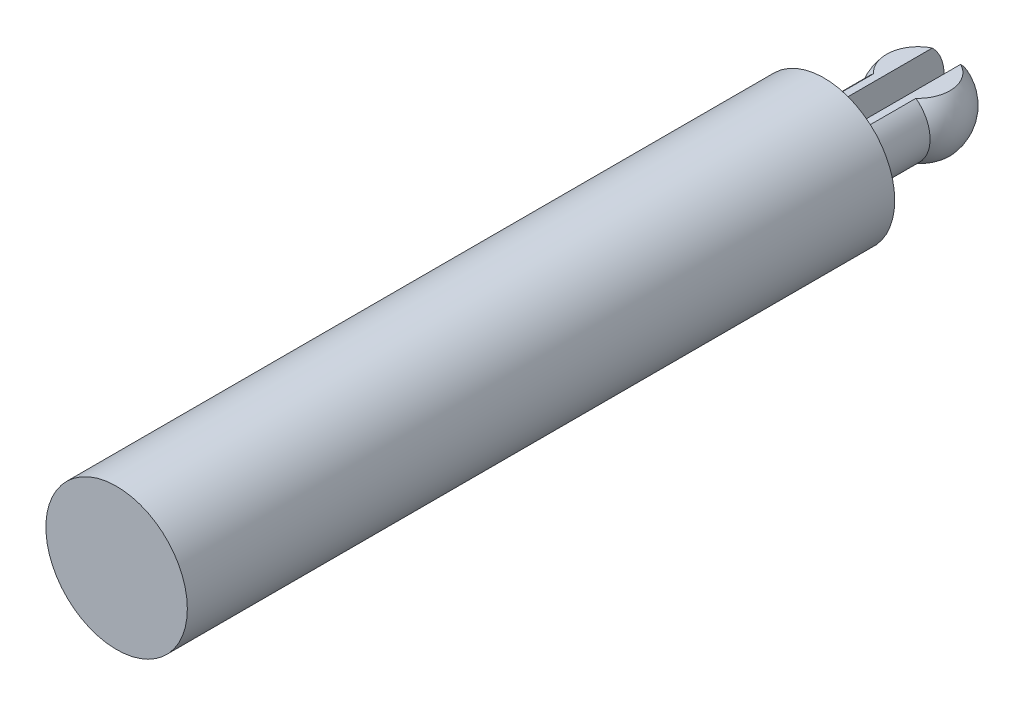
ISO-10303-21;
HEADER;
FILE_DESCRIPTION(('STEP AP214'),'2;1');
FILE_NAME('part.step','',(''),(''),'','','');
FILE_SCHEMA(('AUTOMOTIVE_DESIGN { 1 0 10303 214 1 1 1 1 }'));
ENDSEC;
DATA;
#1=APPLICATION_CONTEXT('core data for automotive mechanical design processes');
#2=APPLICATION_PROTOCOL_DEFINITION('international standard','automotive_design',2000,#1);
#3=PRODUCT_CONTEXT('',#1,'mechanical');
#4=PRODUCT('Part','Part','',(#3));
#5=PRODUCT_RELATED_PRODUCT_CATEGORY('part','',(#4));
#6=PRODUCT_DEFINITION_FORMATION('','',#4);
#7=PRODUCT_DEFINITION_CONTEXT('part definition',#1,'design');
#8=PRODUCT_DEFINITION('design','',#6,#7);
#9=PRODUCT_DEFINITION_SHAPE('','',#8);
#10=(LENGTH_UNIT() NAMED_UNIT(*) SI_UNIT(.MILLI.,.METRE.));
#11=(NAMED_UNIT(*) PLANE_ANGLE_UNIT() SI_UNIT($,.RADIAN.));
#12=(NAMED_UNIT(*) SI_UNIT($,.STERADIAN.) SOLID_ANGLE_UNIT());
#13=UNCERTAINTY_MEASURE_WITH_UNIT(LENGTH_MEASURE(1.E-05),#10,'distance_accuracy_value','');
#14=(GEOMETRIC_REPRESENTATION_CONTEXT(3) GLOBAL_UNCERTAINTY_ASSIGNED_CONTEXT((#13)) GLOBAL_UNIT_ASSIGNED_CONTEXT((#10,
#11,#12)) REPRESENTATION_CONTEXT('',''));
#15=CARTESIAN_POINT('',(0.,0.,0.));
#16=DIRECTION('',(0.,0.,1.));
#17=DIRECTION('',(1.,0.,0.));
#18=AXIS2_PLACEMENT_3D('',#15,#16,#17);
#19=CARTESIAN_POINT('',(0.,0.,-5.));
#20=DIRECTION('',(0.,0.,1.));
#21=DIRECTION('',(1.,0.,0.));
#22=AXIS2_PLACEMENT_3D('',#19,#20,#21);
#23=CYLINDRICAL_SURFACE('',#22,2.5);
#24=DIRECTION('',(0.,0.,1.));
#25=VECTOR('',#24,1.);
#26=CARTESIAN_POINT('',(-1.5,2.,-5.));
#27=LINE('',#26,#25);
#28=CARTESIAN_POINT('',(-1.5,2.,-5.));
#29=VERTEX_POINT('',#28);
#30=CARTESIAN_POINT('',(-1.5,2.,0.));
#31=VERTEX_POINT('',#30);
#32=EDGE_CURVE('E152',#29,#31,#27,.T.);
#33=ORIENTED_EDGE('',*,*,#32,.F.);
#34=CARTESIAN_POINT('',(0.,0.,-5.));
#35=DIRECTION('',(0.,0.,-1.));
#36=DIRECTION('',(-1.,0.,0.));
#37=AXIS2_PLACEMENT_3D('',#34,#35,#36);
#38=CIRCLE('',#37,2.5);
#39=CARTESIAN_POINT('',(-1.5,-2.,-5.));
#40=VERTEX_POINT('',#39);
#41=EDGE_CURVE('E119',#40,#29,#38,.T.);
#42=ORIENTED_EDGE('',*,*,#41,.F.);
#43=DIRECTION('',(0.,0.,1.));
#44=VECTOR('',#43,1.);
#45=CARTESIAN_POINT('',(-1.5,-2.,-5.));
#46=LINE('',#45,#44);
#47=CARTESIAN_POINT('',(-1.5,-2.,0.));
#48=VERTEX_POINT('',#47);
#49=EDGE_CURVE('E106',#48,#40,#46,.F.);
#50=ORIENTED_EDGE('',*,*,#49,.F.);
#51=CARTESIAN_POINT('',(0.,0.,0.));
#52=DIRECTION('',(0.,0.,-1.));
#53=DIRECTION('',(-1.,0.,0.));
#54=AXIS2_PLACEMENT_3D('',#51,#52,#53);
#55=CIRCLE('',#54,2.5);
#56=EDGE_CURVE('E117',#48,#31,#55,.T.);
#57=ORIENTED_EDGE('',*,*,#56,.T.);
#58=EDGE_LOOP('',(#33,#42,#50,#57));
#59=FACE_BOUND('',#58,.T.);
#60=ADVANCED_FACE('F39',(#59),#23,.T.);
#61=CARTESIAN_POINT('',(0.,0.,-6.6583123951777));
#62=DIRECTION('',(0.,1.,0.));
#63=DIRECTION('',(0.,0.,-1.));
#64=AXIS2_PLACEMENT_3D('',#61,#62,#63);
#65=SPHERICAL_SURFACE('',#64,3.);
#66=ORIENTED_EDGE('',*,*,#41,.T.);
#67=CARTESIAN_POINT('',(0.,2.,-6.6583123951777));
#68=DIRECTION('',(0.,1.,0.));
#69=DIRECTION('',(0.,0.,1.));
#70=AXIS2_PLACEMENT_3D('',#67,#68,#69);
#71=CIRCLE('',#70,2.23606797749979);
#72=CARTESIAN_POINT('',(-1.,2.,-8.6583123951777));
#73=VERTEX_POINT('',#72);
#74=EDGE_CURVE('E150',#29,#73,#71,.F.);
#75=ORIENTED_EDGE('',*,*,#74,.T.);
#76=CARTESIAN_POINT('',(-1.,0.,-6.6583123951777));
#77=DIRECTION('',(1.,0.,0.));
#78=DIRECTION('',(0.,0.,-1.));
#79=AXIS2_PLACEMENT_3D('',#76,#77,#78);
#80=CIRCLE('',#79,2.82842712474619);
#81=CARTESIAN_POINT('',(-1.,-2.,-8.6583123951777));
#82=VERTEX_POINT('',#81);
#83=EDGE_CURVE('E129',#73,#82,#80,.F.);
#84=ORIENTED_EDGE('',*,*,#83,.T.);
#85=CARTESIAN_POINT('',(0.,-2.,-6.6583123951777));
#86=DIRECTION('',(0.,-1.,0.));
#87=DIRECTION('',(0.,0.,-1.));
#88=AXIS2_PLACEMENT_3D('',#85,#86,#87);
#89=CIRCLE('',#88,2.23606797749979);
#90=EDGE_CURVE('E121',#82,#40,#89,.F.);
#91=ORIENTED_EDGE('',*,*,#90,.T.);
#92=EDGE_LOOP('',(#66,#75,#84,#91));
#93=FACE_BOUND('',#92,.T.);
#94=ADVANCED_FACE('F149',(#93),#65,.T.);
#95=DIRECTION('',(0.,0.,1.));
#96=VECTOR('',#95,1.);
#97=CARTESIAN_POINT('',(1.5,2.,-5.));
#98=LINE('',#97,#96);
#99=CARTESIAN_POINT('',(1.5,2.,0.));
#100=VERTEX_POINT('',#99);
#101=CARTESIAN_POINT('',(1.5,2.,-5.));
#102=VERTEX_POINT('',#101);
#103=EDGE_CURVE('E165',#100,#102,#98,.F.);
#104=ORIENTED_EDGE('',*,*,#103,.F.);
#105=CARTESIAN_POINT('',(1.5,-2.,0.));
#106=VERTEX_POINT('',#105);
#107=EDGE_CURVE('E125',#100,#106,#55,.T.);
#108=ORIENTED_EDGE('',*,*,#107,.T.);
#109=DIRECTION('',(0.,0.,1.));
#110=VECTOR('',#109,1.);
#111=CARTESIAN_POINT('',(1.5,-2.,-5.));
#112=LINE('',#111,#110);
#113=CARTESIAN_POINT('',(1.5,-2.,-5.));
#114=VERTEX_POINT('',#113);
#115=EDGE_CURVE('E153',#114,#106,#112,.T.);
#116=ORIENTED_EDGE('',*,*,#115,.F.);
#117=EDGE_CURVE('E138',#102,#114,#38,.T.);
#118=ORIENTED_EDGE('',*,*,#117,.F.);
#119=EDGE_LOOP('',(#104,#108,#116,#118));
#120=FACE_BOUND('',#119,.T.);
#121=ADVANCED_FACE('F178',(#120),#23,.T.);
#122=CARTESIAN_POINT('',(1.,0.,-6.6583123951777));
#123=DIRECTION('',(1.,0.,0.));
#124=DIRECTION('',(0.,0.,-1.));
#125=AXIS2_PLACEMENT_3D('',#122,#123,#124);
#126=CIRCLE('',#125,2.82842712474619);
#127=CARTESIAN_POINT('',(1.,2.,-8.6583123951777));
#128=VERTEX_POINT('',#127);
#129=CARTESIAN_POINT('',(1.,-2.,-8.6583123951777));
#130=VERTEX_POINT('',#129);
#131=EDGE_CURVE('E141',#128,#130,#126,.F.);
#132=ORIENTED_EDGE('',*,*,#131,.F.);
#133=CARTESIAN_POINT('',(0.,2.,-6.6583123951777));
#134=DIRECTION('',(0.,1.,0.));
#135=DIRECTION('',(0.,0.,1.));
#136=AXIS2_PLACEMENT_3D('',#133,#134,#135);
#137=CIRCLE('',#136,2.23606797749979);
#138=EDGE_CURVE('E162',#128,#102,#137,.F.);
#139=ORIENTED_EDGE('',*,*,#138,.T.);
#140=ORIENTED_EDGE('',*,*,#117,.T.);
#141=CARTESIAN_POINT('',(0.,-2.,-6.6583123951777));
#142=DIRECTION('',(0.,-1.,0.));
#143=DIRECTION('',(0.,0.,-1.));
#144=AXIS2_PLACEMENT_3D('',#141,#142,#143);
#145=CIRCLE('',#144,2.23606797749979);
#146=EDGE_CURVE('E157',#114,#130,#145,.F.);
#147=ORIENTED_EDGE('',*,*,#146,.T.);
#148=EDGE_LOOP('',(#132,#139,#140,#147));
#149=FACE_BOUND('',#148,.T.);
#150=ADVANCED_FACE('F174',(#149),#65,.T.);
#151=CARTESIAN_POINT('',(1.,-5.28933092224249,-9.6583123951777));
#152=DIRECTION('',(1.,0.,0.));
#153=DIRECTION('',(0.,0.,-1.));
#154=AXIS2_PLACEMENT_3D('',#151,#152,#153);
#155=PLANE('',#154);
#156=DIRECTION('',(0.,0.,1.));
#157=VECTOR('',#156,1.);
#158=CARTESIAN_POINT('',(1.,2.,-9.6583123951777));
#159=LINE('',#158,#157);
#160=CARTESIAN_POINT('',(1.,2.,0.));
#161=VERTEX_POINT('',#160);
#162=EDGE_CURVE('E155',#128,#161,#159,.T.);
#163=ORIENTED_EDGE('',*,*,#162,.F.);
#164=ORIENTED_EDGE('',*,*,#131,.T.);
#165=DIRECTION('',(0.,0.,-1.));
#166=VECTOR('',#165,1.);
#167=CARTESIAN_POINT('',(1.,-2.,-9.6583123951777));
#168=LINE('',#167,#166);
#169=CARTESIAN_POINT('',(1.,-2.,0.));
#170=VERTEX_POINT('',#169);
#171=EDGE_CURVE('E120',#170,#130,#168,.T.);
#172=ORIENTED_EDGE('',*,*,#171,.F.);
#173=DIRECTION('',(0.,1.,0.));
#174=VECTOR('',#173,1.);
#175=CARTESIAN_POINT('',(1.,-5.28933092224249,0.));
#176=LINE('',#175,#174);
#177=EDGE_CURVE('E167',#170,#161,#176,.T.);
#178=ORIENTED_EDGE('',*,*,#177,.T.);
#179=EDGE_LOOP('',(#163,#164,#172,#178));
#180=FACE_BOUND('',#179,.T.);
#181=ADVANCED_FACE('F189',(#180),#155,.F.);
#182=CARTESIAN_POINT('',(-1.,-5.28933092224249,-9.6583123951777));
#183=DIRECTION('',(1.,0.,0.));
#184=DIRECTION('',(0.,0.,-1.));
#185=AXIS2_PLACEMENT_3D('',#182,#183,#184);
#186=PLANE('',#185);
#187=ORIENTED_EDGE('',*,*,#83,.F.);
#188=DIRECTION('',(0.,0.,1.));
#189=VECTOR('',#188,1.);
#190=CARTESIAN_POINT('',(-1.,2.,-9.6583123951777));
#191=LINE('',#190,#189);
#192=CARTESIAN_POINT('',(-1.,2.,0.));
#193=VERTEX_POINT('',#192);
#194=EDGE_CURVE('E11',#73,#193,#191,.T.);
#195=ORIENTED_EDGE('',*,*,#194,.T.);
#196=DIRECTION('',(0.,1.,0.));
#197=VECTOR('',#196,1.);
#198=CARTESIAN_POINT('',(-1.,-5.28933092224249,0.));
#199=LINE('',#198,#197);
#200=CARTESIAN_POINT('',(-1.,-2.,0.));
#201=VERTEX_POINT('',#200);
#202=EDGE_CURVE('E146',#201,#193,#199,.T.);
#203=ORIENTED_EDGE('',*,*,#202,.F.);
#204=DIRECTION('',(0.,0.,-1.));
#205=VECTOR('',#204,1.);
#206=CARTESIAN_POINT('',(-1.,-2.,-9.6583123951777));
#207=LINE('',#206,#205);
#208=EDGE_CURVE('E47',#201,#82,#207,.T.);
#209=ORIENTED_EDGE('',*,*,#208,.T.);
#210=EDGE_LOOP('',(#187,#195,#203,#209));
#211=FACE_BOUND('',#210,.T.);
#212=ADVANCED_FACE('F145',(#211),#186,.T.);
#213=CARTESIAN_POINT('',(0.,0.,50.));
#214=DIRECTION('',(0.,0.,-1.));
#215=DIRECTION('',(-1.,0.,0.));
#216=AXIS2_PLACEMENT_3D('',#213,#214,#215);
#217=CYLINDRICAL_SURFACE('',#216,5.00000000000005);
#218=CARTESIAN_POINT('',(0.,0.,50.));
#219=DIRECTION('',(0.,0.,1.));
#220=DIRECTION('',(1.,0.,0.));
#221=AXIS2_PLACEMENT_3D('',#218,#219,#220);
#222=CIRCLE('',#221,5.00000000000005);
#223=CARTESIAN_POINT('',(5.00000000000005,0.,50.));
#224=VERTEX_POINT('',#223);
#225=EDGE_CURVE('E126',#224,#224,#222,.T.);
#226=ORIENTED_EDGE('',*,*,#225,.F.);
#227=EDGE_LOOP('',(#226));
#228=FACE_BOUND('',#227,.T.);
#229=CARTESIAN_POINT('',(0.,0.,0.));
#230=DIRECTION('',(0.,0.,1.));
#231=DIRECTION('',(1.,0.,0.));
#232=AXIS2_PLACEMENT_3D('',#229,#230,#231);
#233=CIRCLE('',#232,5.00000000000005);
#234=CARTESIAN_POINT('',(5.00000000000005,0.,0.));
#235=VERTEX_POINT('',#234);
#236=EDGE_CURVE('E131',#235,#235,#233,.T.);
#237=ORIENTED_EDGE('',*,*,#236,.T.);
#238=EDGE_LOOP('',(#237));
#239=FACE_BOUND('',#238,.T.);
#240=ADVANCED_FACE('F41',(#228,#239),#217,.T.);
#241=CARTESIAN_POINT('',(0.,0.,50.));
#242=DIRECTION('',(0.,0.,1.));
#243=DIRECTION('',(1.,0.,0.));
#244=AXIS2_PLACEMENT_3D('',#241,#242,#243);
#245=PLANE('',#244);
#246=ORIENTED_EDGE('',*,*,#225,.T.);
#247=EDGE_LOOP('',(#246));
#248=FACE_BOUND('',#247,.T.);
#249=ADVANCED_FACE('F221',(#248),#245,.T.);
#250=CARTESIAN_POINT('',(0.,0.,0.));
#251=DIRECTION('',(0.,0.,1.));
#252=DIRECTION('',(1.,0.,0.));
#253=AXIS2_PLACEMENT_3D('',#250,#251,#252);
#254=PLANE('',#253);
#255=DIRECTION('',(-1.,0.,0.));
#256=VECTOR('',#255,1.);
#257=CARTESIAN_POINT('',(5.00000000000005,2.,0.));
#258=LINE('',#257,#256);
#259=EDGE_CURVE('E110',#193,#31,#258,.T.);
#260=ORIENTED_EDGE('',*,*,#259,.T.);
#261=ORIENTED_EDGE('',*,*,#56,.F.);
#262=DIRECTION('',(1.,0.,0.));
#263=VECTOR('',#262,1.);
#264=CARTESIAN_POINT('',(5.00000000000005,-2.,0.));
#265=LINE('',#264,#263);
#266=EDGE_CURVE('E62',#48,#201,#265,.T.);
#267=ORIENTED_EDGE('',*,*,#266,.T.);
#268=ORIENTED_EDGE('',*,*,#202,.T.);
#269=EDGE_LOOP('',(#260,#261,#267,#268));
#270=FACE_BOUND('',#269,.T.);
#271=ORIENTED_EDGE('',*,*,#107,.F.);
#272=EDGE_CURVE('E54',#100,#161,#258,.T.);
#273=ORIENTED_EDGE('',*,*,#272,.T.);
#274=ORIENTED_EDGE('',*,*,#177,.F.);
#275=EDGE_CURVE('E111',#170,#106,#265,.T.);
#276=ORIENTED_EDGE('',*,*,#275,.T.);
#277=EDGE_LOOP('',(#271,#273,#274,#276));
#278=FACE_BOUND('',#277,.T.);
#279=ORIENTED_EDGE('',*,*,#236,.F.);
#280=EDGE_LOOP('',(#279));
#281=FACE_BOUND('',#280,.T.);
#282=ADVANCED_FACE('F124',(#270,#278,#281),#254,.F.);
#283=CARTESIAN_POINT('',(5.00000000000005,-2.,-9.48673951992389));
#284=DIRECTION('',(0.,-1.,0.));
#285=DIRECTION('',(0.,0.,-1.));
#286=AXIS2_PLACEMENT_3D('',#283,#284,#285);
#287=PLANE('',#286);
#288=ORIENTED_EDGE('',*,*,#49,.T.);
#289=ORIENTED_EDGE('',*,*,#90,.F.);
#290=ORIENTED_EDGE('',*,*,#208,.F.);
#291=ORIENTED_EDGE('',*,*,#266,.F.);
#292=EDGE_LOOP('',(#288,#289,#290,#291));
#293=FACE_BOUND('',#292,.T.);
#294=ADVANCED_FACE('F105',(#293),#287,.T.);
#295=CARTESIAN_POINT('',(5.00000000000005,2.,-9.48673951992389));
#296=DIRECTION('',(0.,1.,0.));
#297=DIRECTION('',(0.,0.,1.));
#298=AXIS2_PLACEMENT_3D('',#295,#296,#297);
#299=PLANE('',#298);
#300=ORIENTED_EDGE('',*,*,#32,.T.);
#301=ORIENTED_EDGE('',*,*,#259,.F.);
#302=ORIENTED_EDGE('',*,*,#194,.F.);
#303=ORIENTED_EDGE('',*,*,#74,.F.);
#304=EDGE_LOOP('',(#300,#301,#302,#303));
#305=FACE_BOUND('',#304,.T.);
#306=ADVANCED_FACE('F194',(#305),#299,.T.);
#307=ORIENTED_EDGE('',*,*,#115,.T.);
#308=ORIENTED_EDGE('',*,*,#275,.F.);
#309=ORIENTED_EDGE('',*,*,#171,.T.);
#310=ORIENTED_EDGE('',*,*,#146,.F.);
#311=EDGE_LOOP('',(#307,#308,#309,#310));
#312=FACE_BOUND('',#311,.T.);
#313=ADVANCED_FACE('F181',(#312),#287,.T.);
#314=ORIENTED_EDGE('',*,*,#103,.T.);
#315=ORIENTED_EDGE('',*,*,#138,.F.);
#316=ORIENTED_EDGE('',*,*,#162,.T.);
#317=ORIENTED_EDGE('',*,*,#272,.F.);
#318=EDGE_LOOP('',(#314,#315,#316,#317));
#319=FACE_BOUND('',#318,.T.);
#320=ADVANCED_FACE('F191',(#319),#299,.T.);
#321=CLOSED_SHELL('',(#60,#94,#121,#150,#181,#212,#240,#249,#282,#294,#306,#313,#320));
#322=MANIFOLD_SOLID_BREP('B2',#321);
#323=ADVANCED_BREP_SHAPE_REPRESENTATION('',(#18,#322),#14);
#324=SHAPE_DEFINITION_REPRESENTATION(#9,#323);
ENDSEC;
END-ISO-10303-21;
